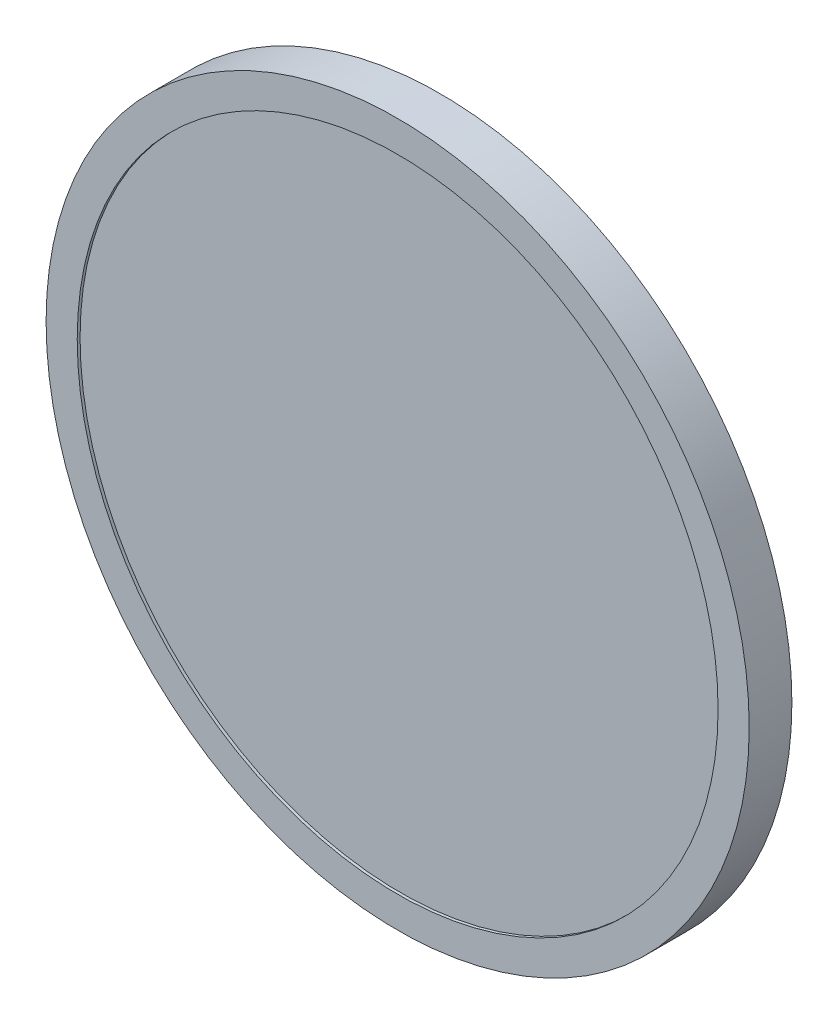
ISO-10303-21;
HEADER;
FILE_DESCRIPTION(('STEP AP214'),'2;1');
FILE_NAME('part.step','',(''),(''),'','','');
FILE_SCHEMA(('AUTOMOTIVE_DESIGN { 1 0 10303 214 1 1 1 1 }'));
ENDSEC;
DATA;
#1=APPLICATION_CONTEXT('core data for automotive mechanical design processes');
#2=APPLICATION_PROTOCOL_DEFINITION('international standard','automotive_design',2000,#1);
#3=PRODUCT_CONTEXT('',#1,'mechanical');
#4=PRODUCT('Part','Part','',(#3));
#5=PRODUCT_RELATED_PRODUCT_CATEGORY('part','',(#4));
#6=PRODUCT_DEFINITION_FORMATION('','',#4);
#7=PRODUCT_DEFINITION_CONTEXT('part definition',#1,'design');
#8=PRODUCT_DEFINITION('design','',#6,#7);
#9=PRODUCT_DEFINITION_SHAPE('','',#8);
#10=(LENGTH_UNIT() NAMED_UNIT(*) SI_UNIT(.MILLI.,.METRE.));
#11=(NAMED_UNIT(*) PLANE_ANGLE_UNIT() SI_UNIT($,.RADIAN.));
#12=(NAMED_UNIT(*) SI_UNIT($,.STERADIAN.) SOLID_ANGLE_UNIT());
#13=UNCERTAINTY_MEASURE_WITH_UNIT(LENGTH_MEASURE(1.E-05),#10,'distance_accuracy_value','');
#14=(GEOMETRIC_REPRESENTATION_CONTEXT(3) GLOBAL_UNCERTAINTY_ASSIGNED_CONTEXT((#13)) GLOBAL_UNIT_ASSIGNED_CONTEXT((#10,
#11,#12)) REPRESENTATION_CONTEXT('',''));
#15=CARTESIAN_POINT('',(0.,0.,0.));
#16=DIRECTION('',(0.,0.,1.));
#17=DIRECTION('',(1.,0.,0.));
#18=AXIS2_PLACEMENT_3D('',#15,#16,#17);
#19=CARTESIAN_POINT('',(0.,0.,3.81));
#20=DIRECTION('',(0.,0.,-1.));
#21=DIRECTION('',(-1.,0.,0.));
#22=AXIS2_PLACEMENT_3D('',#19,#20,#21);
#23=CYLINDRICAL_SURFACE('',#22,31.369);
#24=CARTESIAN_POINT('',(0.,0.,3.81));
#25=DIRECTION('',(0.,0.,1.));
#26=DIRECTION('',(1.,0.,0.));
#27=AXIS2_PLACEMENT_3D('',#24,#25,#26);
#28=CIRCLE('',#27,31.369);
#29=CARTESIAN_POINT('',(-31.369,0.,3.81));
#30=VERTEX_POINT('',#29);
#31=EDGE_CURVE('E10',#30,#30,#28,.T.);
#32=CARTESIAN_POINT('',(0.,0.,0.));
#33=DIRECTION('',(0.,0.,1.));
#34=DIRECTION('',(1.,0.,0.));
#35=AXIS2_PLACEMENT_3D('',#32,#33,#34);
#36=CIRCLE('',#35,31.369);
#37=CARTESIAN_POINT('',(-31.369,0.,0.));
#38=VERTEX_POINT('',#37);
#39=EDGE_CURVE('E40',#38,#38,#36,.T.);
#40=CARTESIAN_POINT('',(-31.369,0.,3.81));
#41=CARTESIAN_POINT('',(-31.369,0.,3.7703125));
#42=CARTESIAN_POINT('',(-31.369,0.,3.730625));
#43=CARTESIAN_POINT('',(-31.369,0.,3.65125));
#44=CARTESIAN_POINT('',(-31.369,0.,3.6115625));
#45=CARTESIAN_POINT('',(-31.369,0.,3.5321875));
#46=CARTESIAN_POINT('',(-31.369,0.,3.4925));
#47=CARTESIAN_POINT('',(-31.369,0.,3.413125));
#48=CARTESIAN_POINT('',(-31.369,0.,3.3734375));
#49=CARTESIAN_POINT('',(-31.369,0.,3.2940625));
#50=CARTESIAN_POINT('',(-31.369,0.,3.254375));
#51=CARTESIAN_POINT('',(-31.369,0.,3.175));
#52=CARTESIAN_POINT('',(-31.369,0.,3.1353125));
#53=CARTESIAN_POINT('',(-31.369,0.,3.0559375));
#54=CARTESIAN_POINT('',(-31.369,0.,3.01625));
#55=CARTESIAN_POINT('',(-31.369,0.,2.936875));
#56=CARTESIAN_POINT('',(-31.369,0.,2.8971875));
#57=CARTESIAN_POINT('',(-31.369,0.,2.8178125));
#58=CARTESIAN_POINT('',(-31.369,0.,2.778125));
#59=CARTESIAN_POINT('',(-31.369,0.,2.69875));
#60=CARTESIAN_POINT('',(-31.369,0.,2.6590625));
#61=CARTESIAN_POINT('',(-31.369,0.,2.5796875));
#62=CARTESIAN_POINT('',(-31.369,0.,2.54));
#63=CARTESIAN_POINT('',(-31.369,0.,2.460625));
#64=CARTESIAN_POINT('',(-31.369,0.,2.4209375));
#65=CARTESIAN_POINT('',(-31.369,0.,2.3415625));
#66=CARTESIAN_POINT('',(-31.369,0.,2.301875));
#67=CARTESIAN_POINT('',(-31.369,0.,2.2225));
#68=CARTESIAN_POINT('',(-31.369,0.,2.1828125));
#69=CARTESIAN_POINT('',(-31.369,0.,2.1034375));
#70=CARTESIAN_POINT('',(-31.369,0.,2.06375));
#71=CARTESIAN_POINT('',(-31.369,0.,1.984375));
#72=CARTESIAN_POINT('',(-31.369,0.,1.9446875));
#73=CARTESIAN_POINT('',(-31.369,0.,1.8653125));
#74=CARTESIAN_POINT('',(-31.369,0.,1.825625));
#75=CARTESIAN_POINT('',(-31.369,0.,1.74625));
#76=CARTESIAN_POINT('',(-31.369,0.,1.7065625));
#77=CARTESIAN_POINT('',(-31.369,0.,1.6271875));
#78=CARTESIAN_POINT('',(-31.369,0.,1.5875));
#79=CARTESIAN_POINT('',(-31.369,0.,1.508125));
#80=CARTESIAN_POINT('',(-31.369,0.,1.4684375));
#81=CARTESIAN_POINT('',(-31.369,0.,1.3890625));
#82=CARTESIAN_POINT('',(-31.369,0.,1.349375));
#83=CARTESIAN_POINT('',(-31.369,0.,1.27));
#84=CARTESIAN_POINT('',(-31.369,0.,1.2303125));
#85=CARTESIAN_POINT('',(-31.369,0.,1.1509375));
#86=CARTESIAN_POINT('',(-31.369,0.,1.11125));
#87=CARTESIAN_POINT('',(-31.369,0.,1.031875));
#88=CARTESIAN_POINT('',(-31.369,0.,0.9921875));
#89=CARTESIAN_POINT('',(-31.369,0.,0.9128125));
#90=CARTESIAN_POINT('',(-31.369,0.,0.873125));
#91=CARTESIAN_POINT('',(-31.369,0.,0.79375));
#92=CARTESIAN_POINT('',(-31.369,0.,0.7540625));
#93=CARTESIAN_POINT('',(-31.369,0.,0.6746875));
#94=CARTESIAN_POINT('',(-31.369,0.,0.635));
#95=CARTESIAN_POINT('',(-31.369,0.,0.555625));
#96=CARTESIAN_POINT('',(-31.369,0.,0.5159375));
#97=CARTESIAN_POINT('',(-31.369,0.,0.4365625));
#98=CARTESIAN_POINT('',(-31.369,0.,0.396875));
#99=CARTESIAN_POINT('',(-31.369,0.,0.3175));
#100=CARTESIAN_POINT('',(-31.369,0.,0.2778125));
#101=CARTESIAN_POINT('',(-31.369,0.,0.1984375));
#102=CARTESIAN_POINT('',(-31.369,0.,0.15875));
#103=CARTESIAN_POINT('',(-31.369,0.,0.0793749999999999));
#104=CARTESIAN_POINT('',(-31.369,0.,0.0396874999999999));
#105=CARTESIAN_POINT('',(-31.369,0.,0.));
#106=B_SPLINE_CURVE_WITH_KNOTS('',3,(#40,#41,#42,#43,#44,#45,#46,#47,#48,#49,#50,#51,#52,#53,
#54,#55,#56,#57,#58,#59,#60,#61,#62,#63,#64,#65,#66,#67,#68,#69,#70,#71,#72,#73,#74,#75,#76,#77,
#78,#79,#80,#81,#82,#83,#84,#85,#86,#87,#88,#89,#90,#91,#92,#93,#94,#95,#96,#97,#98,#99,#100,
#101,#102,#103,#104,#105),.UNSPECIFIED.,.F.,.F.,(4,2,2,2,2,2,2,2,2,2,2,2,2,2,2,2,2,2,2,2,2,2,2,
2,2,2,2,2,2,2,2,2,4),(0.,0.1190625,0.238125,0.3571875,0.47625,0.595312499999999,0.714375,
0.833437499999999,0.952499999999999,1.0715625,1.190625,1.3096875,1.42875,1.5478125,1.666875,
1.7859375,1.905,2.0240625,2.143125,2.2621875,2.38125,2.5003125,2.619375,2.7384375,2.8575,
2.9765625,3.095625,3.2146875,3.33375,3.4528125,3.571875,3.6909375,3.81),.UNSPECIFIED.);
#107=EDGE_CURVE('BSEAM37',#30,#38,#106,.T.);
#108=ORIENTED_EDGE('',*,*,#31,.F.);
#109=ORIENTED_EDGE('',*,*,#39,.T.);
#110=ORIENTED_EDGE('',*,*,#107,.T.);
#111=ORIENTED_EDGE('',*,*,#107,.F.);
#112=EDGE_LOOP('',(#108,#110,#109,#111));
#113=FACE_BOUND('',#112,.T.);
#114=ADVANCED_FACE('F37',(#113),#23,.T.);
#115=CARTESIAN_POINT('',(0.,0.,3.81));
#116=DIRECTION('',(0.,0.,1.));
#117=DIRECTION('',(1.,0.,0.));
#118=AXIS2_PLACEMENT_3D('',#115,#116,#117);
#119=PLANE('',#118);
#120=CARTESIAN_POINT('',(0.,0.,3.81));
#121=DIRECTION('',(0.,0.,1.));
#122=DIRECTION('',(1.,0.,0.));
#123=AXIS2_PLACEMENT_3D('',#120,#121,#122);
#124=CIRCLE('',#123,28.5916200571734);
#125=CARTESIAN_POINT('',(28.5916200571734,0.,3.81));
#126=VERTEX_POINT('',#125);
#127=EDGE_CURVE('E51',#126,#126,#124,.T.);
#128=ORIENTED_EDGE('',*,*,#127,.F.);
#129=EDGE_LOOP('',(#128));
#130=FACE_BOUND('',#129,.T.);
#131=ORIENTED_EDGE('',*,*,#31,.T.);
#132=EDGE_LOOP('',(#131));
#133=FACE_BOUND('',#132,.T.);
#134=ADVANCED_FACE('F68',(#130,#133),#119,.T.);
#135=CARTESIAN_POINT('',(0.,0.,0.));
#136=DIRECTION('',(0.,0.,1.));
#137=DIRECTION('',(1.,0.,0.));
#138=AXIS2_PLACEMENT_3D('',#135,#136,#137);
#139=PLANE('',#138);
#140=ORIENTED_EDGE('',*,*,#39,.F.);
#141=EDGE_LOOP('',(#140));
#142=FACE_BOUND('',#141,.T.);
#143=ADVANCED_FACE('F64',(#142),#139,.F.);
#144=CARTESIAN_POINT('',(0.,0.,3.556));
#145=DIRECTION('',(0.,0.,1.));
#146=DIRECTION('',(1.,0.,0.));
#147=AXIS2_PLACEMENT_3D('',#144,#145,#146);
#148=CYLINDRICAL_SURFACE('',#147,28.5916200571734);
#149=CARTESIAN_POINT('',(0.,0.,3.556));
#150=DIRECTION('',(0.,0.,1.));
#151=DIRECTION('',(1.,0.,0.));
#152=AXIS2_PLACEMENT_3D('',#149,#150,#151);
#153=CIRCLE('',#152,28.5916200571734);
#154=CARTESIAN_POINT('',(28.5916200571734,0.,3.556));
#155=VERTEX_POINT('',#154);
#156=EDGE_CURVE('E49',#155,#155,#153,.T.);
#157=ORIENTED_EDGE('',*,*,#156,.F.);
#158=EDGE_LOOP('',(#157));
#159=FACE_BOUND('',#158,.T.);
#160=ORIENTED_EDGE('',*,*,#127,.T.);
#161=EDGE_LOOP('',(#160));
#162=FACE_BOUND('',#161,.T.);
#163=ADVANCED_FACE('F61',(#159,#162),#148,.F.);
#164=CARTESIAN_POINT('',(0.,0.,3.556));
#165=DIRECTION('',(0.,0.,1.));
#166=DIRECTION('',(1.,0.,0.));
#167=AXIS2_PLACEMENT_3D('',#164,#165,#166);
#168=PLANE('',#167);
#169=ORIENTED_EDGE('',*,*,#156,.T.);
#170=EDGE_LOOP('',(#169));
#171=FACE_BOUND('',#170,.T.);
#172=ADVANCED_FACE('F59',(#171),#168,.T.);
#173=CLOSED_SHELL('',(#114,#134,#143,#163,#172));
#174=MANIFOLD_SOLID_BREP('B2',#173);
#175=ADVANCED_BREP_SHAPE_REPRESENTATION('',(#18,#174),#14);
#176=SHAPE_DEFINITION_REPRESENTATION(#9,#175);
ENDSEC;
END-ISO-10303-21;
